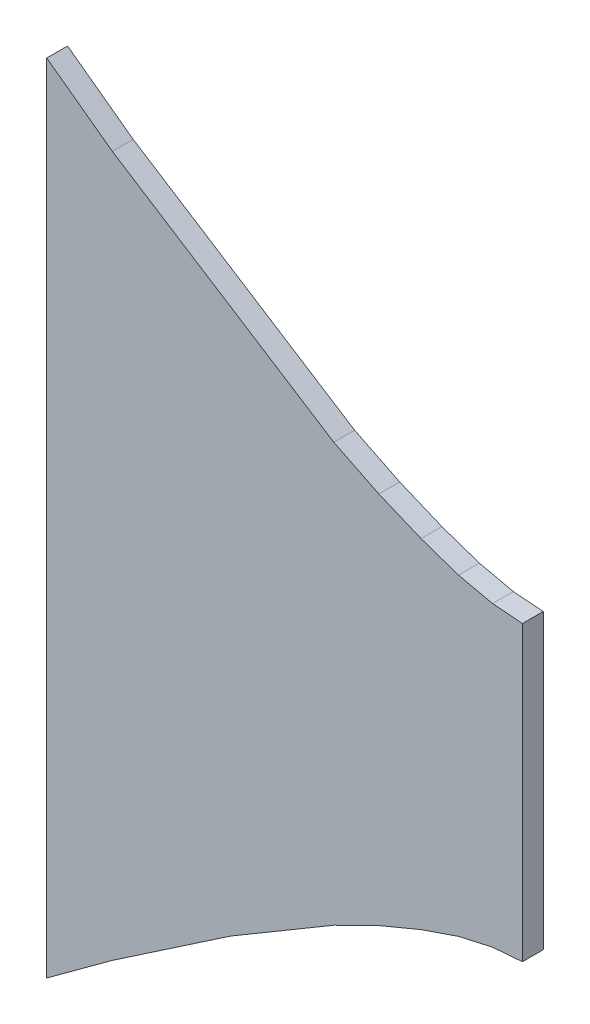
ISO-10303-21;
HEADER;
FILE_DESCRIPTION(('STEP AP214'),'2;1');
FILE_NAME('part.step','',(''),(''),'','','');
FILE_SCHEMA(('AUTOMOTIVE_DESIGN { 1 0 10303 214 1 1 1 1 }'));
ENDSEC;
DATA;
#1=APPLICATION_CONTEXT('core data for automotive mechanical design processes');
#2=APPLICATION_PROTOCOL_DEFINITION('international standard','automotive_design',2000,#1);
#3=PRODUCT_CONTEXT('',#1,'mechanical');
#4=PRODUCT('Part','Part','',(#3));
#5=PRODUCT_RELATED_PRODUCT_CATEGORY('part','',(#4));
#6=PRODUCT_DEFINITION_FORMATION('','',#4);
#7=PRODUCT_DEFINITION_CONTEXT('part definition',#1,'design');
#8=PRODUCT_DEFINITION('design','',#6,#7);
#9=PRODUCT_DEFINITION_SHAPE('','',#8);
#10=(LENGTH_UNIT() NAMED_UNIT(*) SI_UNIT(.MILLI.,.METRE.));
#11=(NAMED_UNIT(*) PLANE_ANGLE_UNIT() SI_UNIT($,.RADIAN.));
#12=(NAMED_UNIT(*) SI_UNIT($,.STERADIAN.) SOLID_ANGLE_UNIT());
#13=UNCERTAINTY_MEASURE_WITH_UNIT(LENGTH_MEASURE(1.E-05),#10,'distance_accuracy_value','');
#14=(GEOMETRIC_REPRESENTATION_CONTEXT(3) GLOBAL_UNCERTAINTY_ASSIGNED_CONTEXT((#13)) GLOBAL_UNIT_ASSIGNED_CONTEXT((#10,
#11,#12)) REPRESENTATION_CONTEXT('',''));
#15=CARTESIAN_POINT('',(0.,0.,0.));
#16=DIRECTION('',(0.,0.,1.));
#17=DIRECTION('',(1.,0.,0.));
#18=AXIS2_PLACEMENT_3D('',#15,#16,#17);
#19=CARTESIAN_POINT('',(40.7220001220703,91.1699981689453,0.));
#20=DIRECTION('',(-0.0782987833422963,-0.996929937622056,0.));
#21=DIRECTION('',(-0.996929937622056,0.0782987833422963,0.));
#22=AXIS2_PLACEMENT_3D('',#19,#20,#21);
#23=PLANE('',#22);
#24=DIRECTION('',(-0.996929937622056,0.0782987833422963,0.));
#25=VECTOR('',#24,1.);
#26=CARTESIAN_POINT('',(40.7220001220703,91.1699981689453,0.03556));
#27=LINE('',#26,#25);
#28=CARTESIAN_POINT('',(40.7220001220703,91.1699981689453,0.03556));
#29=VERTEX_POINT('',#28);
#30=CARTESIAN_POINT('',(40.6710014343262,91.1740036010742,0.03556));
#31=VERTEX_POINT('',#30);
#32=EDGE_CURVE('E11',#29,#31,#27,.T.);
#33=ORIENTED_EDGE('',*,*,#32,.F.);
#34=DIRECTION('',(0.,0.,1.));
#35=VECTOR('',#34,1.);
#36=CARTESIAN_POINT('',(40.7220001220703,91.1699981689453,0.));
#37=LINE('',#36,#35);
#38=CARTESIAN_POINT('',(40.7220001220703,91.1699981689453,0.));
#39=VERTEX_POINT('',#38);
#40=EDGE_CURVE('E24',#39,#29,#37,.T.);
#41=ORIENTED_EDGE('',*,*,#40,.F.);
#42=DIRECTION('',(-0.996929937622056,0.0782987833422963,0.));
#43=VECTOR('',#42,1.);
#44=CARTESIAN_POINT('',(40.7220001220703,91.1699981689453,0.));
#45=LINE('',#44,#43);
#46=CARTESIAN_POINT('',(40.6710014343262,91.1740036010742,0.));
#47=VERTEX_POINT('',#46);
#48=EDGE_CURVE('E154',#39,#47,#45,.T.);
#49=ORIENTED_EDGE('',*,*,#48,.T.);
#50=DIRECTION('',(0.,0.,1.));
#51=VECTOR('',#50,1.);
#52=CARTESIAN_POINT('',(40.6710014343262,91.1740036010742,0.));
#53=LINE('',#52,#51);
#54=EDGE_CURVE('E37',#47,#31,#53,.T.);
#55=ORIENTED_EDGE('',*,*,#54,.T.);
#56=EDGE_LOOP('',(#33,#41,#49,#55));
#57=FACE_BOUND('',#56,.T.);
#58=ADVANCED_FACE('F17',(#57),#23,.F.);
#59=CARTESIAN_POINT('',(40.6710014343262,91.1740036010742,0.));
#60=DIRECTION('',(-0.218588186629587,-0.975817198386045,0.));
#61=DIRECTION('',(-0.975817198386045,0.218588186629587,0.));
#62=AXIS2_PLACEMENT_3D('',#59,#60,#61);
#63=PLANE('',#62);
#64=DIRECTION('',(-0.975817198386045,0.218588186629587,0.));
#65=VECTOR('',#64,1.);
#66=CARTESIAN_POINT('',(40.6710014343262,91.1740036010742,0.03556));
#67=LINE('',#66,#65);
#68=CARTESIAN_POINT('',(40.6129989624023,91.1869964599609,0.03556));
#69=VERTEX_POINT('',#68);
#70=EDGE_CURVE('E266',#31,#69,#67,.T.);
#71=ORIENTED_EDGE('',*,*,#70,.F.);
#72=ORIENTED_EDGE('',*,*,#54,.F.);
#73=DIRECTION('',(-0.975817198386045,0.218588186629587,0.));
#74=VECTOR('',#73,1.);
#75=CARTESIAN_POINT('',(40.6710014343262,91.1740036010742,0.));
#76=LINE('',#75,#74);
#77=CARTESIAN_POINT('',(40.6129989624023,91.1869964599609,0.));
#78=VERTEX_POINT('',#77);
#79=EDGE_CURVE('E263',#47,#78,#76,.T.);
#80=ORIENTED_EDGE('',*,*,#79,.T.);
#81=DIRECTION('',(0.,0.,1.));
#82=VECTOR('',#81,1.);
#83=CARTESIAN_POINT('',(40.6129989624023,91.1869964599609,0.));
#84=LINE('',#83,#82);
#85=EDGE_CURVE('E261',#78,#69,#84,.T.);
#86=ORIENTED_EDGE('',*,*,#85,.T.);
#87=EDGE_LOOP('',(#71,#72,#80,#86));
#88=FACE_BOUND('',#87,.T.);
#89=ADVANCED_FACE('F274',(#88),#63,.F.);
#90=CARTESIAN_POINT('',(40.6129989624023,91.1869964599609,0.));
#91=DIRECTION('',(-0.325125452561408,-0.945670894178699,0.));
#92=DIRECTION('',(-0.945670894178699,0.325125452561408,0.));
#93=AXIS2_PLACEMENT_3D('',#90,#91,#92);
#94=PLANE('',#93);
#95=DIRECTION('',(-0.945670894178699,0.325125452561408,0.));
#96=VECTOR('',#95,1.);
#97=CARTESIAN_POINT('',(40.6129989624023,91.1869964599609,0.03556));
#98=LINE('',#97,#96);
#99=CARTESIAN_POINT('',(40.5489997863769,91.208999633789,0.03556));
#100=VERTEX_POINT('',#99);
#101=EDGE_CURVE('E258',#69,#100,#98,.T.);
#102=ORIENTED_EDGE('',*,*,#101,.F.);
#103=ORIENTED_EDGE('',*,*,#85,.F.);
#104=DIRECTION('',(-0.945670894178699,0.325125452561408,0.));
#105=VECTOR('',#104,1.);
#106=CARTESIAN_POINT('',(40.6129989624023,91.1869964599609,0.));
#107=LINE('',#106,#105);
#108=CARTESIAN_POINT('',(40.5489997863769,91.208999633789,0.));
#109=VERTEX_POINT('',#108);
#110=EDGE_CURVE('E255',#78,#109,#107,.T.);
#111=ORIENTED_EDGE('',*,*,#110,.T.);
#112=DIRECTION('',(0.,0.,1.));
#113=VECTOR('',#112,1.);
#114=CARTESIAN_POINT('',(40.5489997863769,91.208999633789,0.));
#115=LINE('',#114,#113);
#116=EDGE_CURVE('E253',#109,#100,#115,.T.);
#117=ORIENTED_EDGE('',*,*,#116,.T.);
#118=EDGE_LOOP('',(#102,#103,#111,#117));
#119=FACE_BOUND('',#118,.T.);
#120=ADVANCED_FACE('F280',(#119),#94,.F.);
#121=CARTESIAN_POINT('',(40.5489997863769,91.208999633789,0.));
#122=DIRECTION('',(-0.384608439163254,-0.923079816984645,0.));
#123=DIRECTION('',(-0.923079816984645,0.384608439163254,0.));
#124=AXIS2_PLACEMENT_3D('',#121,#122,#123);
#125=PLANE('',#124);
#126=DIRECTION('',(-0.923079816984645,0.384608439163254,0.));
#127=VECTOR('',#126,1.);
#128=CARTESIAN_POINT('',(40.5489997863769,91.208999633789,0.03556));
#129=LINE('',#128,#127);
#130=CARTESIAN_POINT('',(40.4770011901855,91.2389984130859,0.03556));
#131=VERTEX_POINT('',#130);
#132=EDGE_CURVE('E250',#100,#131,#129,.T.);
#133=ORIENTED_EDGE('',*,*,#132,.F.);
#134=ORIENTED_EDGE('',*,*,#116,.F.);
#135=DIRECTION('',(-0.923079816984645,0.384608439163254,0.));
#136=VECTOR('',#135,1.);
#137=CARTESIAN_POINT('',(40.5489997863769,91.208999633789,0.));
#138=LINE('',#137,#136);
#139=CARTESIAN_POINT('',(40.4770011901855,91.2389984130859,0.));
#140=VERTEX_POINT('',#139);
#141=EDGE_CURVE('E247',#109,#140,#138,.T.);
#142=ORIENTED_EDGE('',*,*,#141,.T.);
#143=DIRECTION('',(0.,0.,1.));
#144=VECTOR('',#143,1.);
#145=CARTESIAN_POINT('',(40.4770011901855,91.2389984130859,0.));
#146=LINE('',#145,#144);
#147=EDGE_CURVE('E245',#140,#131,#146,.T.);
#148=ORIENTED_EDGE('',*,*,#147,.T.);
#149=EDGE_LOOP('',(#133,#134,#142,#148));
#150=FACE_BOUND('',#149,.T.);
#151=ADVANCED_FACE('F282',(#150),#125,.F.);
#152=CARTESIAN_POINT('',(40.4770011901855,91.2389984130859,0.));
#153=DIRECTION('',(-0.442569532299855,-0.896734190872573,0.));
#154=DIRECTION('',(-0.896734190872573,0.442569532299855,0.));
#155=AXIS2_PLACEMENT_3D('',#152,#153,#154);
#156=PLANE('',#155);
#157=DIRECTION('',(-0.896734190872573,0.442569532299855,0.));
#158=VECTOR('',#157,1.);
#159=CARTESIAN_POINT('',(40.4770011901855,91.2389984130859,0.03556));
#160=LINE('',#159,#158);
#161=CARTESIAN_POINT('',(40.4000015258789,91.2770004272461,0.03556));
#162=VERTEX_POINT('',#161);
#163=EDGE_CURVE('E242',#131,#162,#160,.T.);
#164=ORIENTED_EDGE('',*,*,#163,.F.);
#165=ORIENTED_EDGE('',*,*,#147,.F.);
#166=DIRECTION('',(-0.896734190872573,0.442569532299855,0.));
#167=VECTOR('',#166,1.);
#168=CARTESIAN_POINT('',(40.4770011901855,91.2389984130859,0.));
#169=LINE('',#168,#167);
#170=CARTESIAN_POINT('',(40.4000015258789,91.2770004272461,0.));
#171=VERTEX_POINT('',#170);
#172=EDGE_CURVE('E239',#140,#171,#169,.T.);
#173=ORIENTED_EDGE('',*,*,#172,.T.);
#174=DIRECTION('',(0.,0.,1.));
#175=VECTOR('',#174,1.);
#176=CARTESIAN_POINT('',(40.4000015258789,91.2770004272461,0.));
#177=LINE('',#176,#175);
#178=EDGE_CURVE('E237',#171,#162,#177,.T.);
#179=ORIENTED_EDGE('',*,*,#178,.T.);
#180=EDGE_LOOP('',(#164,#165,#173,#179));
#181=FACE_BOUND('',#180,.T.);
#182=ADVANCED_FACE('F287',(#181),#156,.F.);
#183=CARTESIAN_POINT('',(40.4000015258789,91.2770004272461,0.));
#184=DIRECTION('',(-0.537590540267876,-0.843206031177727,0.));
#185=DIRECTION('',(-0.843206031177727,0.537590540267876,0.));
#186=AXIS2_PLACEMENT_3D('',#183,#184,#185);
#187=PLANE('',#186);
#188=DIRECTION('',(-0.843206031177727,0.537590540267876,0.));
#189=VECTOR('',#188,1.);
#190=CARTESIAN_POINT('',(40.4000015258789,91.2770004272461,0.03556));
#191=LINE('',#190,#189);
#192=CARTESIAN_POINT('',(40.0219993591309,91.5179977416992,0.03556));
#193=VERTEX_POINT('',#192);
#194=EDGE_CURVE('E234',#162,#193,#191,.T.);
#195=ORIENTED_EDGE('',*,*,#194,.F.);
#196=ORIENTED_EDGE('',*,*,#178,.F.);
#197=DIRECTION('',(-0.843206031177727,0.537590540267876,0.));
#198=VECTOR('',#197,1.);
#199=CARTESIAN_POINT('',(40.4000015258789,91.2770004272461,0.));
#200=LINE('',#199,#198);
#201=CARTESIAN_POINT('',(40.0219993591309,91.5179977416992,0.));
#202=VERTEX_POINT('',#201);
#203=EDGE_CURVE('E231',#171,#202,#200,.T.);
#204=ORIENTED_EDGE('',*,*,#203,.T.);
#205=DIRECTION('',(0.,0.,1.));
#206=VECTOR('',#205,1.);
#207=CARTESIAN_POINT('',(40.0219993591309,91.5179977416992,0.));
#208=LINE('',#207,#206);
#209=EDGE_CURVE('E229',#202,#193,#208,.T.);
#210=ORIENTED_EDGE('',*,*,#209,.T.);
#211=EDGE_LOOP('',(#195,#196,#204,#210));
#212=FACE_BOUND('',#211,.T.);
#213=ADVANCED_FACE('F290',(#212),#187,.F.);
#214=CARTESIAN_POINT('',(40.0219993591309,91.5179977416992,0.));
#215=DIRECTION('',(-0.590743962247607,-0.806859077576746,0.));
#216=DIRECTION('',(-0.806859077576746,0.590743962247607,0.));
#217=AXIS2_PLACEMENT_3D('',#214,#215,#216);
#218=PLANE('',#217);
#219=DIRECTION('',(-0.806859077576746,0.590743962247607,0.));
#220=VECTOR('',#219,1.);
#221=CARTESIAN_POINT('',(40.0219993591309,91.5179977416992,0.03556));
#222=LINE('',#221,#220);
#223=CARTESIAN_POINT('',(39.9099998474121,91.5999984741211,0.03556));
#224=VERTEX_POINT('',#223);
#225=EDGE_CURVE('E226',#193,#224,#222,.T.);
#226=ORIENTED_EDGE('',*,*,#225,.F.);
#227=ORIENTED_EDGE('',*,*,#209,.F.);
#228=DIRECTION('',(-0.806859077576746,0.590743962247607,0.));
#229=VECTOR('',#228,1.);
#230=CARTESIAN_POINT('',(40.0219993591309,91.5179977416992,0.));
#231=LINE('',#230,#229);
#232=CARTESIAN_POINT('',(39.9099998474121,91.5999984741211,0.));
#233=VERTEX_POINT('',#232);
#234=EDGE_CURVE('E223',#202,#233,#231,.T.);
#235=ORIENTED_EDGE('',*,*,#234,.T.);
#236=DIRECTION('',(0.,0.,1.));
#237=VECTOR('',#236,1.);
#238=CARTESIAN_POINT('',(39.9099998474121,91.5999984741211,0.));
#239=LINE('',#238,#237);
#240=EDGE_CURVE('E221',#233,#224,#239,.T.);
#241=ORIENTED_EDGE('',*,*,#240,.T.);
#242=EDGE_LOOP('',(#226,#227,#235,#241));
#243=FACE_BOUND('',#242,.T.);
#244=ADVANCED_FACE('F295',(#243),#218,.F.);
#245=CARTESIAN_POINT('',(39.9099998474121,91.5999984741211,0.));
#246=DIRECTION('',(1.,0.,0.));
#247=DIRECTION('',(0.,-1.,0.));
#248=AXIS2_PLACEMENT_3D('',#245,#246,#247);
#249=PLANE('',#248);
#250=DIRECTION('',(0.,-1.,0.));
#251=VECTOR('',#250,1.);
#252=CARTESIAN_POINT('',(39.9099998474121,91.5999984741211,0.03556));
#253=LINE('',#252,#251);
#254=CARTESIAN_POINT('',(39.9099998474121,90.2399978637695,0.03556));
#255=VERTEX_POINT('',#254);
#256=EDGE_CURVE('E218',#224,#255,#253,.T.);
#257=ORIENTED_EDGE('',*,*,#256,.F.);
#258=ORIENTED_EDGE('',*,*,#240,.F.);
#259=DIRECTION('',(0.,-1.,0.));
#260=VECTOR('',#259,1.);
#261=CARTESIAN_POINT('',(39.9099998474121,91.5999984741211,0.));
#262=LINE('',#261,#260);
#263=CARTESIAN_POINT('',(39.9099998474121,90.2399978637695,0.));
#264=VERTEX_POINT('',#263);
#265=EDGE_CURVE('E215',#233,#264,#262,.T.);
#266=ORIENTED_EDGE('',*,*,#265,.T.);
#267=DIRECTION('',(0.,0.,1.));
#268=VECTOR('',#267,1.);
#269=CARTESIAN_POINT('',(39.9099998474121,90.2399978637695,0.));
#270=LINE('',#269,#268);
#271=EDGE_CURVE('E213',#264,#255,#270,.T.);
#272=ORIENTED_EDGE('',*,*,#271,.T.);
#273=EDGE_LOOP('',(#257,#258,#266,#272));
#274=FACE_BOUND('',#273,.T.);
#275=ADVANCED_FACE('F298',(#274),#249,.F.);
#276=CARTESIAN_POINT('',(39.9099998474121,90.2399978637695,0.));
#277=DIRECTION('',(-0.590743962247607,0.806859077576746,0.));
#278=DIRECTION('',(0.806859077576746,0.590743962247607,0.));
#279=AXIS2_PLACEMENT_3D('',#276,#277,#278);
#280=PLANE('',#279);
#281=DIRECTION('',(0.806859077576746,0.590743962247607,0.));
#282=VECTOR('',#281,1.);
#283=CARTESIAN_POINT('',(39.9099998474121,90.2399978637695,0.03556));
#284=LINE('',#283,#282);
#285=CARTESIAN_POINT('',(40.0219993591309,90.3219985961914,0.03556));
#286=VERTEX_POINT('',#285);
#287=EDGE_CURVE('E210',#255,#286,#284,.T.);
#288=ORIENTED_EDGE('',*,*,#287,.F.);
#289=ORIENTED_EDGE('',*,*,#271,.F.);
#290=DIRECTION('',(0.806859077576746,0.590743962247607,0.));
#291=VECTOR('',#290,1.);
#292=CARTESIAN_POINT('',(39.9099998474121,90.2399978637695,0.));
#293=LINE('',#292,#291);
#294=CARTESIAN_POINT('',(40.0219993591309,90.3219985961914,0.));
#295=VERTEX_POINT('',#294);
#296=EDGE_CURVE('E207',#264,#295,#293,.T.);
#297=ORIENTED_EDGE('',*,*,#296,.T.);
#298=DIRECTION('',(0.,0.,1.));
#299=VECTOR('',#298,1.);
#300=CARTESIAN_POINT('',(40.0219993591309,90.3219985961914,0.));
#301=LINE('',#300,#299);
#302=EDGE_CURVE('E205',#295,#286,#301,.T.);
#303=ORIENTED_EDGE('',*,*,#302,.T.);
#304=EDGE_LOOP('',(#288,#289,#297,#303));
#305=FACE_BOUND('',#304,.T.);
#306=ADVANCED_FACE('F303',(#305),#280,.F.);
#307=CARTESIAN_POINT('',(40.0219993591309,90.3219985961914,0.));
#308=DIRECTION('',(-0.561304570964436,0.827609315205206,0.));
#309=DIRECTION('',(0.827609315205206,0.561304570964436,0.));
#310=AXIS2_PLACEMENT_3D('',#307,#308,#309);
#311=PLANE('',#310);
#312=DIRECTION('',(0.827609315205206,0.561304570964436,0.));
#313=VECTOR('',#312,1.);
#314=CARTESIAN_POINT('',(40.0219993591309,90.3219985961914,0.03556));
#315=LINE('',#314,#313);
#316=CARTESIAN_POINT('',(40.2239990234375,90.4589996337891,0.03556));
#317=VERTEX_POINT('',#316);
#318=EDGE_CURVE('E202',#286,#317,#315,.T.);
#319=ORIENTED_EDGE('',*,*,#318,.F.);
#320=ORIENTED_EDGE('',*,*,#302,.F.);
#321=DIRECTION('',(0.827609315205206,0.561304570964436,0.));
#322=VECTOR('',#321,1.);
#323=CARTESIAN_POINT('',(40.0219993591309,90.3219985961914,0.));
#324=LINE('',#323,#322);
#325=CARTESIAN_POINT('',(40.2239990234375,90.4589996337891,0.));
#326=VERTEX_POINT('',#325);
#327=EDGE_CURVE('E199',#295,#326,#324,.T.);
#328=ORIENTED_EDGE('',*,*,#327,.T.);
#329=DIRECTION('',(0.,0.,1.));
#330=VECTOR('',#329,1.);
#331=CARTESIAN_POINT('',(40.2239990234375,90.4589996337891,0.));
#332=LINE('',#331,#330);
#333=EDGE_CURVE('E197',#326,#317,#332,.T.);
#334=ORIENTED_EDGE('',*,*,#333,.T.);
#335=EDGE_LOOP('',(#319,#320,#328,#334));
#336=FACE_BOUND('',#335,.T.);
#337=ADVANCED_FACE('F306',(#336),#311,.F.);
#338=CARTESIAN_POINT('',(40.2239990234375,90.4589996337891,0.));
#339=DIRECTION('',(-0.508738113307092,0.860921327456081,0.));
#340=DIRECTION('',(0.860921327456081,0.508738113307092,0.));
#341=AXIS2_PLACEMENT_3D('',#338,#339,#340);
#342=PLANE('',#341);
#343=DIRECTION('',(0.860921327456081,0.508738113307092,0.));
#344=VECTOR('',#343,1.);
#345=CARTESIAN_POINT('',(40.2239990234375,90.4589996337891,0.03556));
#346=LINE('',#345,#344);
#347=CARTESIAN_POINT('',(40.4000015258789,90.5630035400391,0.03556));
#348=VERTEX_POINT('',#347);
#349=EDGE_CURVE('E194',#317,#348,#346,.T.);
#350=ORIENTED_EDGE('',*,*,#349,.F.);
#351=ORIENTED_EDGE('',*,*,#333,.F.);
#352=DIRECTION('',(0.860921327456081,0.508738113307092,0.));
#353=VECTOR('',#352,1.);
#354=CARTESIAN_POINT('',(40.2239990234375,90.4589996337891,0.));
#355=LINE('',#354,#353);
#356=CARTESIAN_POINT('',(40.4000015258789,90.5630035400391,0.));
#357=VERTEX_POINT('',#356);
#358=EDGE_CURVE('E191',#326,#357,#355,.T.);
#359=ORIENTED_EDGE('',*,*,#358,.T.);
#360=DIRECTION('',(0.,0.,1.));
#361=VECTOR('',#360,1.);
#362=CARTESIAN_POINT('',(40.4000015258789,90.5630035400391,0.));
#363=LINE('',#362,#361);
#364=EDGE_CURVE('E189',#357,#348,#363,.T.);
#365=ORIENTED_EDGE('',*,*,#364,.T.);
#366=EDGE_LOOP('',(#350,#351,#359,#365));
#367=FACE_BOUND('',#366,.T.);
#368=ADVANCED_FACE('F311',(#367),#342,.F.);
#369=CARTESIAN_POINT('',(40.4000015258789,90.5630035400391,0.));
#370=DIRECTION('',(-0.442498079698508,0.896769451678152,0.));
#371=DIRECTION('',(0.896769451678152,0.442498079698508,0.));
#372=AXIS2_PLACEMENT_3D('',#369,#370,#371);
#373=PLANE('',#372);
#374=DIRECTION('',(0.896769451678152,0.442498079698508,0.));
#375=VECTOR('',#374,1.);
#376=CARTESIAN_POINT('',(40.4000015258789,90.5630035400391,0.03556));
#377=LINE('',#376,#375);
#378=CARTESIAN_POINT('',(40.4770011901855,90.6009979248047,0.03556));
#379=VERTEX_POINT('',#378);
#380=EDGE_CURVE('E186',#348,#379,#377,.T.);
#381=ORIENTED_EDGE('',*,*,#380,.F.);
#382=ORIENTED_EDGE('',*,*,#364,.F.);
#383=DIRECTION('',(0.896769451678152,0.442498079698508,0.));
#384=VECTOR('',#383,1.);
#385=CARTESIAN_POINT('',(40.4000015258789,90.5630035400391,0.));
#386=LINE('',#385,#384);
#387=CARTESIAN_POINT('',(40.4770011901855,90.6009979248047,0.));
#388=VERTEX_POINT('',#387);
#389=EDGE_CURVE('E183',#357,#388,#386,.T.);
#390=ORIENTED_EDGE('',*,*,#389,.T.);
#391=DIRECTION('',(0.,0.,1.));
#392=VECTOR('',#391,1.);
#393=CARTESIAN_POINT('',(40.4770011901855,90.6009979248047,0.));
#394=LINE('',#393,#392);
#395=EDGE_CURVE('E181',#388,#379,#394,.T.);
#396=ORIENTED_EDGE('',*,*,#395,.T.);
#397=EDGE_LOOP('',(#381,#382,#390,#396));
#398=FACE_BOUND('',#397,.T.);
#399=ADVANCED_FACE('F314',(#398),#373,.F.);
#400=CARTESIAN_POINT('',(40.4770011901855,90.6009979248047,0.));
#401=DIRECTION('',(-0.384608439163254,0.923079816984645,0.));
#402=DIRECTION('',(0.923079816984645,0.384608439163254,0.));
#403=AXIS2_PLACEMENT_3D('',#400,#401,#402);
#404=PLANE('',#403);
#405=DIRECTION('',(0.923079816984645,0.384608439163254,0.));
#406=VECTOR('',#405,1.);
#407=CARTESIAN_POINT('',(40.4770011901855,90.6009979248047,0.03556));
#408=LINE('',#407,#406);
#409=CARTESIAN_POINT('',(40.5489997863769,90.6309967041016,0.03556));
#410=VERTEX_POINT('',#409);
#411=EDGE_CURVE('E178',#379,#410,#408,.T.);
#412=ORIENTED_EDGE('',*,*,#411,.F.);
#413=ORIENTED_EDGE('',*,*,#395,.F.);
#414=DIRECTION('',(0.923079816984645,0.384608439163254,0.));
#415=VECTOR('',#414,1.);
#416=CARTESIAN_POINT('',(40.4770011901855,90.6009979248047,0.));
#417=LINE('',#416,#415);
#418=CARTESIAN_POINT('',(40.5489997863769,90.6309967041016,0.));
#419=VERTEX_POINT('',#418);
#420=EDGE_CURVE('E175',#388,#419,#417,.T.);
#421=ORIENTED_EDGE('',*,*,#420,.T.);
#422=DIRECTION('',(0.,0.,1.));
#423=VECTOR('',#422,1.);
#424=CARTESIAN_POINT('',(40.5489997863769,90.6309967041016,0.));
#425=LINE('',#424,#423);
#426=EDGE_CURVE('E173',#419,#410,#425,.T.);
#427=ORIENTED_EDGE('',*,*,#426,.T.);
#428=EDGE_LOOP('',(#412,#413,#421,#427));
#429=FACE_BOUND('',#428,.T.);
#430=ADVANCED_FACE('F319',(#429),#404,.F.);
#431=CARTESIAN_POINT('',(40.5489997863769,90.6309967041016,0.));
#432=DIRECTION('',(-0.325125452561408,0.945670894178699,0.));
#433=DIRECTION('',(0.945670894178699,0.325125452561408,0.));
#434=AXIS2_PLACEMENT_3D('',#431,#432,#433);
#435=PLANE('',#434);
#436=DIRECTION('',(0.945670894178699,0.325125452561408,0.));
#437=VECTOR('',#436,1.);
#438=CARTESIAN_POINT('',(40.5489997863769,90.6309967041016,0.03556));
#439=LINE('',#438,#437);
#440=CARTESIAN_POINT('',(40.6129989624023,90.6529998779297,0.03556));
#441=VERTEX_POINT('',#440);
#442=EDGE_CURVE('E170',#410,#441,#439,.T.);
#443=ORIENTED_EDGE('',*,*,#442,.F.);
#444=ORIENTED_EDGE('',*,*,#426,.F.);
#445=DIRECTION('',(0.945670894178699,0.325125452561408,0.));
#446=VECTOR('',#445,1.);
#447=CARTESIAN_POINT('',(40.5489997863769,90.6309967041016,0.));
#448=LINE('',#447,#446);
#449=CARTESIAN_POINT('',(40.6129989624023,90.6529998779297,0.));
#450=VERTEX_POINT('',#449);
#451=EDGE_CURVE('E167',#419,#450,#448,.T.);
#452=ORIENTED_EDGE('',*,*,#451,.T.);
#453=DIRECTION('',(0.,0.,1.));
#454=VECTOR('',#453,1.);
#455=CARTESIAN_POINT('',(40.6129989624023,90.6529998779297,0.));
#456=LINE('',#455,#454);
#457=EDGE_CURVE('E165',#450,#441,#456,.T.);
#458=ORIENTED_EDGE('',*,*,#457,.T.);
#459=EDGE_LOOP('',(#443,#444,#452,#458));
#460=FACE_BOUND('',#459,.T.);
#461=ADVANCED_FACE('F322',(#460),#435,.F.);
#462=CARTESIAN_POINT('',(40.6129989624023,90.6529998779297,0.));
#463=DIRECTION('',(-0.218710403369533,0.975789813155444,0.));
#464=DIRECTION('',(0.975789813155444,0.218710403369533,0.));
#465=AXIS2_PLACEMENT_3D('',#462,#463,#464);
#466=PLANE('',#465);
#467=DIRECTION('',(0.975789813155444,0.218710403369533,0.));
#468=VECTOR('',#467,1.);
#469=CARTESIAN_POINT('',(40.6129989624023,90.6529998779297,0.03556));
#470=LINE('',#469,#468);
#471=CARTESIAN_POINT('',(40.6710014343262,90.6660003662109,0.03556));
#472=VERTEX_POINT('',#471);
#473=EDGE_CURVE('E162',#441,#472,#470,.T.);
#474=ORIENTED_EDGE('',*,*,#473,.F.);
#475=ORIENTED_EDGE('',*,*,#457,.F.);
#476=DIRECTION('',(0.975789813155444,0.218710403369533,0.));
#477=VECTOR('',#476,1.);
#478=CARTESIAN_POINT('',(40.6129989624023,90.6529998779297,0.));
#479=LINE('',#478,#477);
#480=CARTESIAN_POINT('',(40.6710014343262,90.6660003662109,0.));
#481=VERTEX_POINT('',#480);
#482=EDGE_CURVE('E160',#450,#481,#479,.T.);
#483=ORIENTED_EDGE('',*,*,#482,.T.);
#484=DIRECTION('',(0.,0.,1.));
#485=VECTOR('',#484,1.);
#486=CARTESIAN_POINT('',(40.6710014343262,90.6660003662109,0.));
#487=LINE('',#486,#485);
#488=EDGE_CURVE('E145',#481,#472,#487,.T.);
#489=ORIENTED_EDGE('',*,*,#488,.T.);
#490=EDGE_LOOP('',(#474,#475,#483,#489));
#491=FACE_BOUND('',#490,.T.);
#492=ADVANCED_FACE('F325',(#491),#466,.F.);
#493=CARTESIAN_POINT('',(40.6710014343262,90.6660003662109,0.));
#494=DIRECTION('',(-0.0781505545436505,0.996941568410366,0.));
#495=DIRECTION('',(0.996941568410366,0.0781505545436505,0.));
#496=AXIS2_PLACEMENT_3D('',#493,#494,#495);
#497=PLANE('',#496);
#498=DIRECTION('',(0.996941568410366,0.0781505545436505,0.));
#499=VECTOR('',#498,1.);
#500=CARTESIAN_POINT('',(40.6710014343262,90.6660003662109,0.03556));
#501=LINE('',#500,#499);
#502=CARTESIAN_POINT('',(40.7220001220703,90.6699981689453,0.03556));
#503=VERTEX_POINT('',#502);
#504=EDGE_CURVE('E149',#472,#503,#501,.T.);
#505=ORIENTED_EDGE('',*,*,#504,.F.);
#506=ORIENTED_EDGE('',*,*,#488,.F.);
#507=DIRECTION('',(0.996941568410366,0.0781505545436505,0.));
#508=VECTOR('',#507,1.);
#509=CARTESIAN_POINT('',(40.6710014343262,90.6660003662109,0.));
#510=LINE('',#509,#508);
#511=CARTESIAN_POINT('',(40.7220001220703,90.6699981689453,0.));
#512=VERTEX_POINT('',#511);
#513=EDGE_CURVE('E141',#481,#512,#510,.T.);
#514=ORIENTED_EDGE('',*,*,#513,.T.);
#515=DIRECTION('',(0.,0.,1.));
#516=VECTOR('',#515,1.);
#517=CARTESIAN_POINT('',(40.7220001220703,90.6699981689453,0.));
#518=LINE('',#517,#516);
#519=EDGE_CURVE('E131',#512,#503,#518,.T.);
#520=ORIENTED_EDGE('',*,*,#519,.T.);
#521=EDGE_LOOP('',(#505,#506,#514,#520));
#522=FACE_BOUND('',#521,.T.);
#523=ADVANCED_FACE('F144',(#522),#497,.F.);
#524=CARTESIAN_POINT('',(40.7220001220703,90.6699981689453,0.));
#525=DIRECTION('',(-1.,0.,0.));
#526=DIRECTION('',(0.,1.,0.));
#527=AXIS2_PLACEMENT_3D('',#524,#525,#526);
#528=PLANE('',#527);
#529=DIRECTION('',(0.,1.,0.));
#530=VECTOR('',#529,1.);
#531=CARTESIAN_POINT('',(40.7220001220703,90.6699981689453,0.03556));
#532=LINE('',#531,#530);
#533=EDGE_CURVE('E137',#503,#29,#532,.T.);
#534=ORIENTED_EDGE('',*,*,#533,.F.);
#535=ORIENTED_EDGE('',*,*,#519,.F.);
#536=DIRECTION('',(0.,1.,0.));
#537=VECTOR('',#536,1.);
#538=CARTESIAN_POINT('',(40.7220001220703,90.6699981689453,0.));
#539=LINE('',#538,#537);
#540=EDGE_CURVE('E135',#512,#39,#539,.T.);
#541=ORIENTED_EDGE('',*,*,#540,.T.);
#542=ORIENTED_EDGE('',*,*,#40,.T.);
#543=EDGE_LOOP('',(#534,#535,#541,#542));
#544=FACE_BOUND('',#543,.T.);
#545=ADVANCED_FACE('F133',(#544),#528,.F.);
#546=CARTESIAN_POINT('',(40.7220001220703,91.1699981689453,0.));
#547=DIRECTION('',(0.,0.,1.));
#548=DIRECTION('',(1.,0.,0.));
#549=AXIS2_PLACEMENT_3D('',#546,#547,#548);
#550=PLANE('',#549);
#551=ORIENTED_EDGE('',*,*,#540,.F.);
#552=ORIENTED_EDGE('',*,*,#513,.F.);
#553=ORIENTED_EDGE('',*,*,#482,.F.);
#554=ORIENTED_EDGE('',*,*,#451,.F.);
#555=ORIENTED_EDGE('',*,*,#420,.F.);
#556=ORIENTED_EDGE('',*,*,#389,.F.);
#557=ORIENTED_EDGE('',*,*,#358,.F.);
#558=ORIENTED_EDGE('',*,*,#327,.F.);
#559=ORIENTED_EDGE('',*,*,#296,.F.);
#560=ORIENTED_EDGE('',*,*,#265,.F.);
#561=ORIENTED_EDGE('',*,*,#234,.F.);
#562=ORIENTED_EDGE('',*,*,#203,.F.);
#563=ORIENTED_EDGE('',*,*,#172,.F.);
#564=ORIENTED_EDGE('',*,*,#141,.F.);
#565=ORIENTED_EDGE('',*,*,#110,.F.);
#566=ORIENTED_EDGE('',*,*,#79,.F.);
#567=ORIENTED_EDGE('',*,*,#48,.F.);
#568=EDGE_LOOP('',(#551,#552,#553,#554,#555,#556,#557,#558,#559,#560,#561,#562,#563,#564,#565,
#566,#567));
#569=FACE_BOUND('',#568,.T.);
#570=ADVANCED_FACE('F152',(#569),#550,.F.);
#571=CARTESIAN_POINT('',(40.7220001220703,91.1699981689453,0.03556));
#572=DIRECTION('',(0.,0.,1.));
#573=DIRECTION('',(1.,0.,0.));
#574=AXIS2_PLACEMENT_3D('',#571,#572,#573);
#575=PLANE('',#574);
#576=ORIENTED_EDGE('',*,*,#32,.T.);
#577=ORIENTED_EDGE('',*,*,#70,.T.);
#578=ORIENTED_EDGE('',*,*,#101,.T.);
#579=ORIENTED_EDGE('',*,*,#132,.T.);
#580=ORIENTED_EDGE('',*,*,#163,.T.);
#581=ORIENTED_EDGE('',*,*,#194,.T.);
#582=ORIENTED_EDGE('',*,*,#225,.T.);
#583=ORIENTED_EDGE('',*,*,#256,.T.);
#584=ORIENTED_EDGE('',*,*,#287,.T.);
#585=ORIENTED_EDGE('',*,*,#318,.T.);
#586=ORIENTED_EDGE('',*,*,#349,.T.);
#587=ORIENTED_EDGE('',*,*,#380,.T.);
#588=ORIENTED_EDGE('',*,*,#411,.T.);
#589=ORIENTED_EDGE('',*,*,#442,.T.);
#590=ORIENTED_EDGE('',*,*,#473,.T.);
#591=ORIENTED_EDGE('',*,*,#504,.T.);
#592=ORIENTED_EDGE('',*,*,#533,.T.);
#593=EDGE_LOOP('',(#576,#577,#578,#579,#580,#581,#582,#583,#584,#585,#586,#587,#588,#589,#590,
#591,#592));
#594=FACE_BOUND('',#593,.T.);
#595=ADVANCED_FACE('F277',(#594),#575,.T.);
#596=CLOSED_SHELL('',(#58,#89,#120,#151,#182,#213,#244,#275,#306,#337,#368,#399,#430,#461,#492,
#523,#545,#570,#595));
#597=MANIFOLD_SOLID_BREP('B1',#596);
#598=ADVANCED_BREP_SHAPE_REPRESENTATION('',(#18,#597),#14);
#599=SHAPE_DEFINITION_REPRESENTATION(#9,#598);
ENDSEC;
END-ISO-10303-21;
